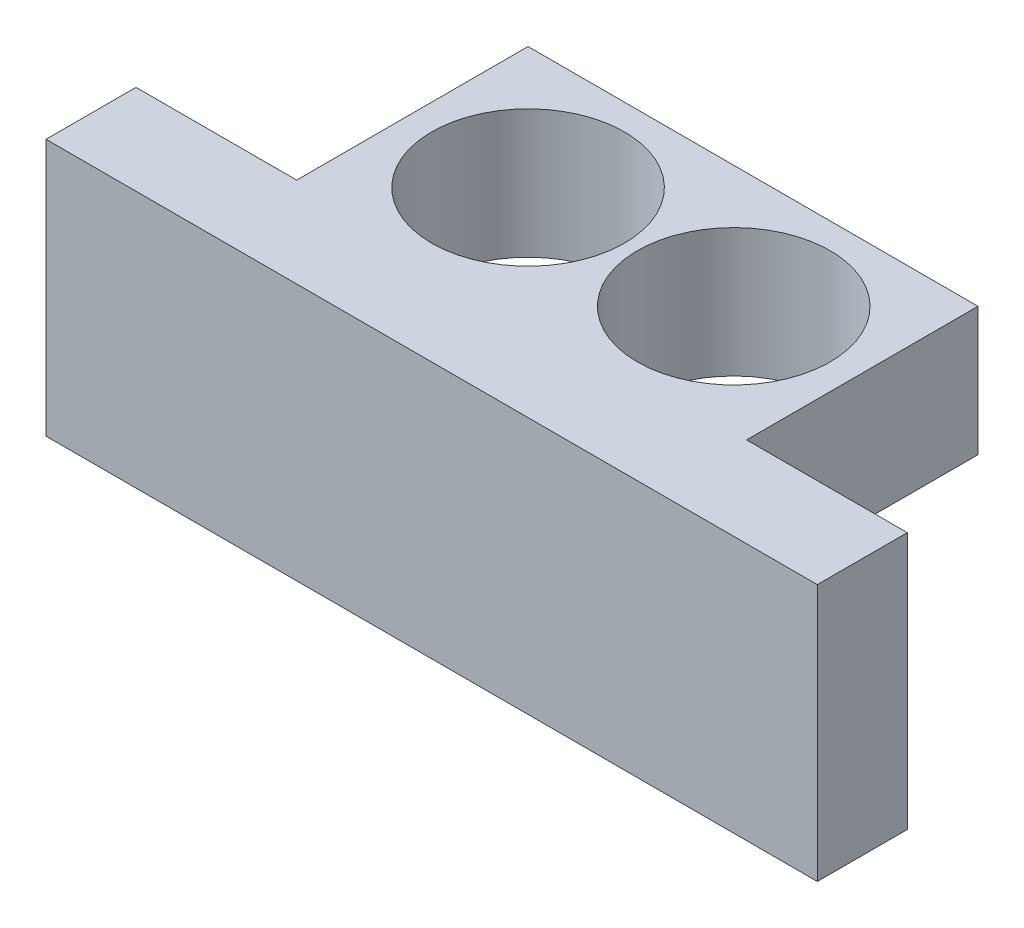
ISO-10303-21;
HEADER;
FILE_DESCRIPTION(('STEP AP214'),'2;1');
FILE_NAME('part.step','',(''),(''),'','','');
FILE_SCHEMA(('AUTOMOTIVE_DESIGN { 1 0 10303 214 1 1 1 1 }'));
ENDSEC;
DATA;
#1=APPLICATION_CONTEXT('core data for automotive mechanical design processes');
#2=APPLICATION_PROTOCOL_DEFINITION('international standard','automotive_design',2000,#1);
#3=PRODUCT_CONTEXT('',#1,'mechanical');
#4=PRODUCT('Part','Part','',(#3));
#5=PRODUCT_RELATED_PRODUCT_CATEGORY('part','',(#4));
#6=PRODUCT_DEFINITION_FORMATION('','',#4);
#7=PRODUCT_DEFINITION_CONTEXT('part definition',#1,'design');
#8=PRODUCT_DEFINITION('design','',#6,#7);
#9=PRODUCT_DEFINITION_SHAPE('','',#8);
#10=(LENGTH_UNIT() NAMED_UNIT(*) SI_UNIT(.MILLI.,.METRE.));
#11=(NAMED_UNIT(*) PLANE_ANGLE_UNIT() SI_UNIT($,.RADIAN.));
#12=(NAMED_UNIT(*) SI_UNIT($,.STERADIAN.) SOLID_ANGLE_UNIT());
#13=UNCERTAINTY_MEASURE_WITH_UNIT(LENGTH_MEASURE(1.E-05),#10,'distance_accuracy_value','');
#14=(GEOMETRIC_REPRESENTATION_CONTEXT(3) GLOBAL_UNCERTAINTY_ASSIGNED_CONTEXT((#13)) GLOBAL_UNIT_ASSIGNED_CONTEXT((#10,
#11,#12)) REPRESENTATION_CONTEXT('',''));
#15=CARTESIAN_POINT('',(0.,0.,0.));
#16=DIRECTION('',(0.,0.,1.));
#17=DIRECTION('',(1.,0.,0.));
#18=AXIS2_PLACEMENT_3D('',#15,#16,#17);
#19=CARTESIAN_POINT('',(15.,10.,6.25));
#20=DIRECTION('',(-1.,0.,0.));
#21=DIRECTION('',(0.,0.,1.));
#22=AXIS2_PLACEMENT_3D('',#19,#20,#21);
#23=PLANE('',#22);
#24=DIRECTION('',(0.,0.,-1.));
#25=VECTOR('',#24,1.);
#26=CARTESIAN_POINT('',(15.,0.,6.25));
#27=LINE('',#26,#25);
#28=CARTESIAN_POINT('',(15.,0.,6.25));
#29=VERTEX_POINT('',#28);
#30=CARTESIAN_POINT('',(15.,0.,2.75));
#31=VERTEX_POINT('',#30);
#32=EDGE_CURVE('E110',#29,#31,#27,.T.);
#33=ORIENTED_EDGE('',*,*,#32,.T.);
#34=DIRECTION('',(0.,1.,0.));
#35=VECTOR('',#34,1.);
#36=CARTESIAN_POINT('',(15.,0.,2.75));
#37=LINE('',#36,#35);
#38=CARTESIAN_POINT('',(15.,10.,2.75));
#39=VERTEX_POINT('',#38);
#40=EDGE_CURVE('E95',#31,#39,#37,.T.);
#41=ORIENTED_EDGE('',*,*,#40,.T.);
#42=DIRECTION('',(0.,0.,-1.));
#43=VECTOR('',#42,1.);
#44=CARTESIAN_POINT('',(15.,10.,6.25));
#45=LINE('',#44,#43);
#46=CARTESIAN_POINT('',(15.,10.,6.25));
#47=VERTEX_POINT('',#46);
#48=EDGE_CURVE('E108',#47,#39,#45,.T.);
#49=ORIENTED_EDGE('',*,*,#48,.F.);
#50=DIRECTION('',(0.,-1.,0.));
#51=VECTOR('',#50,1.);
#52=CARTESIAN_POINT('',(15.,10.,6.25));
#53=LINE('',#52,#51);
#54=EDGE_CURVE('E41',#47,#29,#53,.T.);
#55=ORIENTED_EDGE('',*,*,#54,.T.);
#56=EDGE_LOOP('',(#33,#41,#49,#55));
#57=FACE_BOUND('',#56,.T.);
#58=ADVANCED_FACE('F33',(#57),#23,.F.);
#59=CARTESIAN_POINT('',(-15.,10.,-6.25));
#60=DIRECTION('',(0.,0.,1.));
#61=DIRECTION('',(1.,0.,0.));
#62=AXIS2_PLACEMENT_3D('',#59,#60,#61);
#63=PLANE('',#62);
#64=DIRECTION('',(0.,1.,0.));
#65=VECTOR('',#64,1.);
#66=CARTESIAN_POINT('',(8.75,0.,-6.25));
#67=LINE('',#66,#65);
#68=CARTESIAN_POINT('',(8.75,5.,-6.25));
#69=VERTEX_POINT('',#68);
#70=CARTESIAN_POINT('',(8.75,10.,-6.25));
#71=VERTEX_POINT('',#70);
#72=EDGE_CURVE('E102',#69,#71,#67,.T.);
#73=ORIENTED_EDGE('',*,*,#72,.F.);
#74=DIRECTION('',(1.,0.,0.));
#75=VECTOR('',#74,1.);
#76=CARTESIAN_POINT('',(-8.75,5.,-6.25));
#77=LINE('',#76,#75);
#78=CARTESIAN_POINT('',(-8.75,5.,-6.25));
#79=VERTEX_POINT('',#78);
#80=EDGE_CURVE('E166',#79,#69,#77,.T.);
#81=ORIENTED_EDGE('',*,*,#80,.F.);
#82=DIRECTION('',(0.,1.,0.));
#83=VECTOR('',#82,1.);
#84=CARTESIAN_POINT('',(-8.75,0.,-6.25));
#85=LINE('',#84,#83);
#86=CARTESIAN_POINT('',(-8.75,10.,-6.25));
#87=VERTEX_POINT('',#86);
#88=EDGE_CURVE('E128',#79,#87,#85,.T.);
#89=ORIENTED_EDGE('',*,*,#88,.T.);
#90=DIRECTION('',(-1.,0.,0.));
#91=VECTOR('',#90,1.);
#92=CARTESIAN_POINT('',(-15.,10.,-6.25));
#93=LINE('',#92,#91);
#94=EDGE_CURVE('E115',#71,#87,#93,.T.);
#95=ORIENTED_EDGE('',*,*,#94,.F.);
#96=EDGE_LOOP('',(#73,#81,#89,#95));
#97=FACE_BOUND('',#96,.T.);
#98=ADVANCED_FACE('F162',(#97),#63,.F.);
#99=CARTESIAN_POINT('',(-15.,10.,6.25));
#100=DIRECTION('',(1.,0.,0.));
#101=DIRECTION('',(0.,0.,-1.));
#102=AXIS2_PLACEMENT_3D('',#99,#100,#101);
#103=PLANE('',#102);
#104=DIRECTION('',(0.,0.,1.));
#105=VECTOR('',#104,1.);
#106=CARTESIAN_POINT('',(-15.,10.,6.25));
#107=LINE('',#106,#105);
#108=CARTESIAN_POINT('',(-15.,10.,2.75));
#109=VERTEX_POINT('',#108);
#110=CARTESIAN_POINT('',(-15.,10.,6.25));
#111=VERTEX_POINT('',#110);
#112=EDGE_CURVE('E118',#109,#111,#107,.T.);
#113=ORIENTED_EDGE('',*,*,#112,.F.);
#114=DIRECTION('',(0.,1.,0.));
#115=VECTOR('',#114,1.);
#116=CARTESIAN_POINT('',(-15.,0.,2.75));
#117=LINE('',#116,#115);
#118=CARTESIAN_POINT('',(-15.,0.,2.75));
#119=VERTEX_POINT('',#118);
#120=EDGE_CURVE('E133',#119,#109,#117,.T.);
#121=ORIENTED_EDGE('',*,*,#120,.F.);
#122=DIRECTION('',(0.,0.,1.));
#123=VECTOR('',#122,1.);
#124=CARTESIAN_POINT('',(-15.,0.,6.25));
#125=LINE('',#124,#123);
#126=CARTESIAN_POINT('',(-15.,0.,6.25));
#127=VERTEX_POINT('',#126);
#128=EDGE_CURVE('E60',#119,#127,#125,.T.);
#129=ORIENTED_EDGE('',*,*,#128,.T.);
#130=DIRECTION('',(0.,-1.,0.));
#131=VECTOR('',#130,1.);
#132=CARTESIAN_POINT('',(-15.,10.,6.25));
#133=LINE('',#132,#131);
#134=EDGE_CURVE('E11',#111,#127,#133,.T.);
#135=ORIENTED_EDGE('',*,*,#134,.F.);
#136=EDGE_LOOP('',(#113,#121,#129,#135));
#137=FACE_BOUND('',#136,.T.);
#138=ADVANCED_FACE('F173',(#137),#103,.F.);
#139=CARTESIAN_POINT('',(-15.,10.,6.25));
#140=DIRECTION('',(0.,0.,-1.));
#141=DIRECTION('',(-1.,0.,0.));
#142=AXIS2_PLACEMENT_3D('',#139,#140,#141);
#143=PLANE('',#142);
#144=DIRECTION('',(1.,0.,0.));
#145=VECTOR('',#144,1.);
#146=CARTESIAN_POINT('',(-15.,0.,6.25));
#147=LINE('',#146,#145);
#148=EDGE_CURVE('E116',#127,#29,#147,.T.);
#149=ORIENTED_EDGE('',*,*,#148,.T.);
#150=ORIENTED_EDGE('',*,*,#54,.F.);
#151=DIRECTION('',(1.,0.,0.));
#152=VECTOR('',#151,1.);
#153=CARTESIAN_POINT('',(-15.,10.,6.25));
#154=LINE('',#153,#152);
#155=EDGE_CURVE('E49',#111,#47,#154,.T.);
#156=ORIENTED_EDGE('',*,*,#155,.F.);
#157=ORIENTED_EDGE('',*,*,#134,.T.);
#158=EDGE_LOOP('',(#149,#150,#156,#157));
#159=FACE_BOUND('',#158,.T.);
#160=ADVANCED_FACE('F174',(#159),#143,.F.);
#161=CARTESIAN_POINT('',(0.,10.,0.));
#162=DIRECTION('',(0.,-1.,0.));
#163=DIRECTION('',(0.,0.,-1.));
#164=AXIS2_PLACEMENT_3D('',#161,#162,#163);
#165=PLANE('',#164);
#166=CARTESIAN_POINT('',(4.,10.,-1.5));
#167=DIRECTION('',(0.,1.,0.));
#168=DIRECTION('',(0.,0.,1.));
#169=AXIS2_PLACEMENT_3D('',#166,#167,#168);
#170=CIRCLE('',#169,3.75);
#171=CARTESIAN_POINT('',(4.,10.,2.25));
#172=VERTEX_POINT('',#171);
#173=EDGE_CURVE('E147',#172,#172,#170,.T.);
#174=ORIENTED_EDGE('',*,*,#173,.F.);
#175=EDGE_LOOP('',(#174));
#176=FACE_BOUND('',#175,.T.);
#177=CARTESIAN_POINT('',(-4.,10.,-1.5));
#178=DIRECTION('',(0.,1.,0.));
#179=DIRECTION('',(0.,0.,1.));
#180=AXIS2_PLACEMENT_3D('',#177,#178,#179);
#181=CIRCLE('',#180,3.75);
#182=CARTESIAN_POINT('',(-4.,10.,2.25));
#183=VERTEX_POINT('',#182);
#184=EDGE_CURVE('E122',#183,#183,#181,.T.);
#185=ORIENTED_EDGE('',*,*,#184,.F.);
#186=EDGE_LOOP('',(#185));
#187=FACE_BOUND('',#186,.T.);
#188=ORIENTED_EDGE('',*,*,#94,.T.);
#189=DIRECTION('',(0.,0.,-1.));
#190=VECTOR('',#189,1.);
#191=CARTESIAN_POINT('',(-8.75,10.,-6.25));
#192=LINE('',#191,#190);
#193=CARTESIAN_POINT('',(-8.75,10.,2.75));
#194=VERTEX_POINT('',#193);
#195=EDGE_CURVE('E134',#194,#87,#192,.T.);
#196=ORIENTED_EDGE('',*,*,#195,.F.);
#197=DIRECTION('',(1.,0.,0.));
#198=VECTOR('',#197,1.);
#199=CARTESIAN_POINT('',(-15.,10.,2.75));
#200=LINE('',#199,#198);
#201=EDGE_CURVE('E111',#109,#194,#200,.T.);
#202=ORIENTED_EDGE('',*,*,#201,.F.);
#203=ORIENTED_EDGE('',*,*,#112,.T.);
#204=ORIENTED_EDGE('',*,*,#155,.T.);
#205=ORIENTED_EDGE('',*,*,#48,.T.);
#206=DIRECTION('',(1.,0.,0.));
#207=VECTOR('',#206,1.);
#208=CARTESIAN_POINT('',(15.,10.,2.75));
#209=LINE('',#208,#207);
#210=CARTESIAN_POINT('',(8.75,10.,2.75));
#211=VERTEX_POINT('',#210);
#212=EDGE_CURVE('E91',#211,#39,#209,.T.);
#213=ORIENTED_EDGE('',*,*,#212,.F.);
#214=DIRECTION('',(0.,0.,1.));
#215=VECTOR('',#214,1.);
#216=CARTESIAN_POINT('',(8.75,10.,-6.25));
#217=LINE('',#216,#215);
#218=EDGE_CURVE('E103',#71,#211,#217,.T.);
#219=ORIENTED_EDGE('',*,*,#218,.F.);
#220=EDGE_LOOP('',(#188,#196,#202,#203,#204,#205,#213,#219));
#221=FACE_BOUND('',#220,.T.);
#222=ADVANCED_FACE('F114',(#176,#187,#221),#165,.F.);
#223=CARTESIAN_POINT('',(0.,0.,0.));
#224=DIRECTION('',(0.,-1.,0.));
#225=DIRECTION('',(0.,0.,-1.));
#226=AXIS2_PLACEMENT_3D('',#223,#224,#225);
#227=PLANE('',#226);
#228=DIRECTION('',(1.,0.,0.));
#229=VECTOR('',#228,1.);
#230=CARTESIAN_POINT('',(-15.,0.,2.75));
#231=LINE('',#230,#229);
#232=EDGE_CURVE('E69',#119,#31,#231,.T.);
#233=ORIENTED_EDGE('',*,*,#232,.T.);
#234=ORIENTED_EDGE('',*,*,#32,.F.);
#235=ORIENTED_EDGE('',*,*,#148,.F.);
#236=ORIENTED_EDGE('',*,*,#128,.F.);
#237=EDGE_LOOP('',(#233,#234,#235,#236));
#238=FACE_BOUND('',#237,.T.);
#239=ADVANCED_FACE('F132',(#238),#227,.T.);
#240=CARTESIAN_POINT('',(8.75,0.,-6.25));
#241=DIRECTION('',(-1.,0.,0.));
#242=DIRECTION('',(0.,0.,1.));
#243=AXIS2_PLACEMENT_3D('',#240,#241,#242);
#244=PLANE('',#243);
#245=DIRECTION('',(0.,1.,0.));
#246=VECTOR('',#245,1.);
#247=CARTESIAN_POINT('',(8.75,0.,2.75));
#248=LINE('',#247,#246);
#249=CARTESIAN_POINT('',(8.75,5.,2.75));
#250=VERTEX_POINT('',#249);
#251=EDGE_CURVE('E99',#250,#211,#248,.T.);
#252=ORIENTED_EDGE('',*,*,#251,.F.);
#253=DIRECTION('',(0.,0.,1.));
#254=VECTOR('',#253,1.);
#255=CARTESIAN_POINT('',(8.75,5.,-6.25));
#256=LINE('',#255,#254);
#257=EDGE_CURVE('E157',#69,#250,#256,.T.);
#258=ORIENTED_EDGE('',*,*,#257,.F.);
#259=ORIENTED_EDGE('',*,*,#72,.T.);
#260=ORIENTED_EDGE('',*,*,#218,.T.);
#261=EDGE_LOOP('',(#252,#258,#259,#260));
#262=FACE_BOUND('',#261,.T.);
#263=ADVANCED_FACE('F154',(#262),#244,.F.);
#264=CARTESIAN_POINT('',(-4.,0.,-1.5));
#265=DIRECTION('',(0.,1.,0.));
#266=DIRECTION('',(0.,0.,1.));
#267=AXIS2_PLACEMENT_3D('',#264,#265,#266);
#268=CYLINDRICAL_SURFACE('',#267,3.75);
#269=CARTESIAN_POINT('',(-4.,5.,-1.5));
#270=DIRECTION('',(0.,1.,0.));
#271=DIRECTION('',(0.,0.,1.));
#272=AXIS2_PLACEMENT_3D('',#269,#270,#271);
#273=CIRCLE('',#272,3.75);
#274=CARTESIAN_POINT('',(-4.,5.,2.25));
#275=VERTEX_POINT('',#274);
#276=EDGE_CURVE('E142',#275,#275,#273,.F.);
#277=ORIENTED_EDGE('',*,*,#276,.T.);
#278=EDGE_LOOP('',(#277));
#279=FACE_BOUND('',#278,.T.);
#280=ORIENTED_EDGE('',*,*,#184,.T.);
#281=EDGE_LOOP('',(#280));
#282=FACE_BOUND('',#281,.T.);
#283=ADVANCED_FACE('F217',(#279,#282),#268,.F.);
#284=CARTESIAN_POINT('',(4.,0.,-1.5));
#285=DIRECTION('',(0.,1.,0.));
#286=DIRECTION('',(0.,0.,1.));
#287=AXIS2_PLACEMENT_3D('',#284,#285,#286);
#288=CYLINDRICAL_SURFACE('',#287,3.75);
#289=CARTESIAN_POINT('',(4.,5.,-1.5));
#290=DIRECTION('',(0.,1.,0.));
#291=DIRECTION('',(0.,0.,1.));
#292=AXIS2_PLACEMENT_3D('',#289,#290,#291);
#293=CIRCLE('',#292,3.75);
#294=CARTESIAN_POINT('',(4.,5.,2.25));
#295=VERTEX_POINT('',#294);
#296=EDGE_CURVE('E278',#295,#295,#293,.F.);
#297=ORIENTED_EDGE('',*,*,#296,.T.);
#298=EDGE_LOOP('',(#297));
#299=FACE_BOUND('',#298,.T.);
#300=ORIENTED_EDGE('',*,*,#173,.T.);
#301=EDGE_LOOP('',(#300));
#302=FACE_BOUND('',#301,.T.);
#303=ADVANCED_FACE('F224',(#299,#302),#288,.F.);
#304=CARTESIAN_POINT('',(-8.75,0.,-6.25));
#305=DIRECTION('',(1.,0.,0.));
#306=DIRECTION('',(0.,0.,-1.));
#307=AXIS2_PLACEMENT_3D('',#304,#305,#306);
#308=PLANE('',#307);
#309=ORIENTED_EDGE('',*,*,#88,.F.);
#310=DIRECTION('',(0.,0.,-1.));
#311=VECTOR('',#310,1.);
#312=CARTESIAN_POINT('',(-8.75,5.,-6.25));
#313=LINE('',#312,#311);
#314=CARTESIAN_POINT('',(-8.75,5.,2.75));
#315=VERTEX_POINT('',#314);
#316=EDGE_CURVE('E282',#315,#79,#313,.T.);
#317=ORIENTED_EDGE('',*,*,#316,.F.);
#318=DIRECTION('',(0.,1.,0.));
#319=VECTOR('',#318,1.);
#320=CARTESIAN_POINT('',(-8.75,0.,2.75));
#321=LINE('',#320,#319);
#322=EDGE_CURVE('E136',#315,#194,#321,.T.);
#323=ORIENTED_EDGE('',*,*,#322,.T.);
#324=ORIENTED_EDGE('',*,*,#195,.T.);
#325=EDGE_LOOP('',(#309,#317,#323,#324));
#326=FACE_BOUND('',#325,.T.);
#327=ADVANCED_FACE('F169',(#326),#308,.F.);
#328=CARTESIAN_POINT('',(-15.,0.,2.75));
#329=DIRECTION('',(0.,0.,1.));
#330=DIRECTION('',(1.,0.,0.));
#331=AXIS2_PLACEMENT_3D('',#328,#329,#330);
#332=PLANE('',#331);
#333=ORIENTED_EDGE('',*,*,#201,.T.);
#334=ORIENTED_EDGE('',*,*,#322,.F.);
#335=DIRECTION('',(-1.,0.,0.));
#336=VECTOR('',#335,1.);
#337=CARTESIAN_POINT('',(-8.75,5.,2.75));
#338=LINE('',#337,#336);
#339=EDGE_CURVE('E285',#250,#315,#338,.T.);
#340=ORIENTED_EDGE('',*,*,#339,.F.);
#341=ORIENTED_EDGE('',*,*,#251,.T.);
#342=ORIENTED_EDGE('',*,*,#212,.T.);
#343=ORIENTED_EDGE('',*,*,#40,.F.);
#344=ORIENTED_EDGE('',*,*,#232,.F.);
#345=ORIENTED_EDGE('',*,*,#120,.T.);
#346=EDGE_LOOP('',(#333,#334,#340,#341,#342,#343,#344,#345));
#347=FACE_BOUND('',#346,.T.);
#348=ADVANCED_FACE('F94',(#347),#332,.F.);
#349=CARTESIAN_POINT('',(0.,5.,0.));
#350=DIRECTION('',(0.,1.,0.));
#351=DIRECTION('',(0.,0.,1.));
#352=AXIS2_PLACEMENT_3D('',#349,#350,#351);
#353=PLANE('',#352);
#354=ORIENTED_EDGE('',*,*,#296,.F.);
#355=EDGE_LOOP('',(#354));
#356=FACE_BOUND('',#355,.T.);
#357=ORIENTED_EDGE('',*,*,#316,.T.);
#358=ORIENTED_EDGE('',*,*,#80,.T.);
#359=ORIENTED_EDGE('',*,*,#257,.T.);
#360=ORIENTED_EDGE('',*,*,#339,.T.);
#361=EDGE_LOOP('',(#357,#358,#359,#360));
#362=FACE_BOUND('',#361,.T.);
#363=ORIENTED_EDGE('',*,*,#276,.F.);
#364=EDGE_LOOP('',(#363));
#365=FACE_BOUND('',#364,.T.);
#366=ADVANCED_FACE('F245',(#356,#362,#365),#353,.F.);
#367=CLOSED_SHELL('',(#58,#98,#138,#160,#222,#239,#263,#283,#303,#327,#348,#366));
#368=MANIFOLD_SOLID_BREP('B2',#367);
#369=ADVANCED_BREP_SHAPE_REPRESENTATION('',(#18,#368),#14);
#370=SHAPE_DEFINITION_REPRESENTATION(#9,#369);
ENDSEC;
END-ISO-10303-21;
